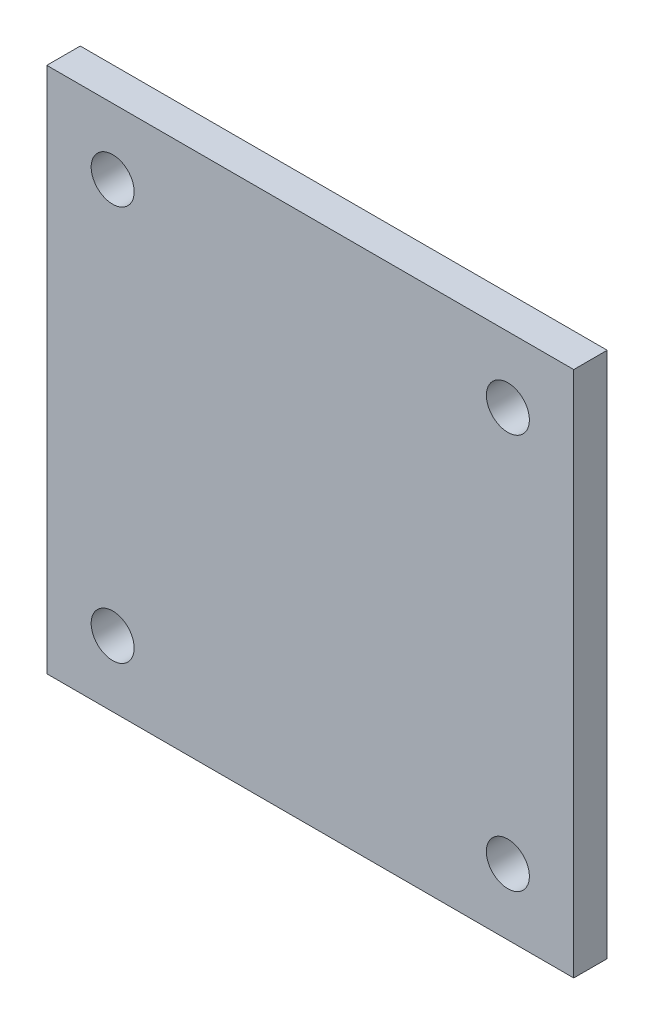
ISO-10303-21;
HEADER;
FILE_DESCRIPTION(('STEP AP214'),'2;1');
FILE_NAME('part.step','',(''),(''),'','','');
FILE_SCHEMA(('AUTOMOTIVE_DESIGN { 1 0 10303 214 1 1 1 1 }'));
ENDSEC;
DATA;
#1=APPLICATION_CONTEXT('core data for automotive mechanical design processes');
#2=APPLICATION_PROTOCOL_DEFINITION('international standard','automotive_design',2000,#1);
#3=PRODUCT_CONTEXT('',#1,'mechanical');
#4=PRODUCT('Part','Part','',(#3));
#5=PRODUCT_RELATED_PRODUCT_CATEGORY('part','',(#4));
#6=PRODUCT_DEFINITION_FORMATION('','',#4);
#7=PRODUCT_DEFINITION_CONTEXT('part definition',#1,'design');
#8=PRODUCT_DEFINITION('design','',#6,#7);
#9=PRODUCT_DEFINITION_SHAPE('','',#8);
#10=(LENGTH_UNIT() NAMED_UNIT(*) SI_UNIT(.MILLI.,.METRE.));
#11=(NAMED_UNIT(*) PLANE_ANGLE_UNIT() SI_UNIT($,.RADIAN.));
#12=(NAMED_UNIT(*) SI_UNIT($,.STERADIAN.) SOLID_ANGLE_UNIT());
#13=UNCERTAINTY_MEASURE_WITH_UNIT(LENGTH_MEASURE(1.E-05),#10,'distance_accuracy_value','');
#14=(GEOMETRIC_REPRESENTATION_CONTEXT(3) GLOBAL_UNCERTAINTY_ASSIGNED_CONTEXT((#13)) GLOBAL_UNIT_ASSIGNED_CONTEXT((#10,
#11,#12)) REPRESENTATION_CONTEXT('',''));
#15=CARTESIAN_POINT('',(0.,0.,0.));
#16=DIRECTION('',(0.,0.,1.));
#17=DIRECTION('',(1.,0.,0.));
#18=AXIS2_PLACEMENT_3D('',#15,#16,#17);
#19=CARTESIAN_POINT('',(20.,20.,2.54));
#20=DIRECTION('',(-1.,0.,0.));
#21=DIRECTION('',(0.,-1.,0.));
#22=AXIS2_PLACEMENT_3D('',#19,#20,#21);
#23=PLANE('',#22);
#24=DIRECTION('',(0.,1.,0.));
#25=VECTOR('',#24,1.);
#26=CARTESIAN_POINT('',(20.,20.,0.));
#27=LINE('',#26,#25);
#28=CARTESIAN_POINT('',(20.,-20.,0.));
#29=VERTEX_POINT('',#28);
#30=CARTESIAN_POINT('',(20.,20.,0.));
#31=VERTEX_POINT('',#30);
#32=EDGE_CURVE('E97',#29,#31,#27,.T.);
#33=ORIENTED_EDGE('',*,*,#32,.T.);
#34=DIRECTION('',(0.,0.,-1.));
#35=VECTOR('',#34,1.);
#36=CARTESIAN_POINT('',(20.,20.,2.54));
#37=LINE('',#36,#35);
#38=CARTESIAN_POINT('',(20.,20.,2.54));
#39=VERTEX_POINT('',#38);
#40=EDGE_CURVE('E11',#39,#31,#37,.T.);
#41=ORIENTED_EDGE('',*,*,#40,.F.);
#42=DIRECTION('',(0.,1.,0.));
#43=VECTOR('',#42,1.);
#44=CARTESIAN_POINT('',(20.,20.,2.54));
#45=LINE('',#44,#43);
#46=CARTESIAN_POINT('',(20.,-20.,2.54));
#47=VERTEX_POINT('',#46);
#48=EDGE_CURVE('E85',#47,#39,#45,.T.);
#49=ORIENTED_EDGE('',*,*,#48,.F.);
#50=DIRECTION('',(0.,0.,-1.));
#51=VECTOR('',#50,1.);
#52=CARTESIAN_POINT('',(20.,-20.,2.54));
#53=LINE('',#52,#51);
#54=EDGE_CURVE('E93',#47,#29,#53,.T.);
#55=ORIENTED_EDGE('',*,*,#54,.T.);
#56=EDGE_LOOP('',(#33,#41,#49,#55));
#57=FACE_BOUND('',#56,.T.);
#58=ADVANCED_FACE('F34',(#57),#23,.F.);
#59=CARTESIAN_POINT('',(-20.,20.,2.54));
#60=DIRECTION('',(0.,-1.,0.));
#61=DIRECTION('',(0.,0.,-1.));
#62=AXIS2_PLACEMENT_3D('',#59,#60,#61);
#63=PLANE('',#62);
#64=DIRECTION('',(-1.,0.,0.));
#65=VECTOR('',#64,1.);
#66=CARTESIAN_POINT('',(-20.,20.,0.));
#67=LINE('',#66,#65);
#68=CARTESIAN_POINT('',(-20.,20.,0.));
#69=VERTEX_POINT('',#68);
#70=EDGE_CURVE('E89',#31,#69,#67,.T.);
#71=ORIENTED_EDGE('',*,*,#70,.T.);
#72=DIRECTION('',(0.,0.,-1.));
#73=VECTOR('',#72,1.);
#74=CARTESIAN_POINT('',(-20.,20.,2.54));
#75=LINE('',#74,#73);
#76=CARTESIAN_POINT('',(-20.,20.,2.54));
#77=VERTEX_POINT('',#76);
#78=EDGE_CURVE('E42',#77,#69,#75,.T.);
#79=ORIENTED_EDGE('',*,*,#78,.F.);
#80=DIRECTION('',(-1.,0.,0.));
#81=VECTOR('',#80,1.);
#82=CARTESIAN_POINT('',(-20.,20.,2.54));
#83=LINE('',#82,#81);
#84=EDGE_CURVE('E80',#39,#77,#83,.T.);
#85=ORIENTED_EDGE('',*,*,#84,.F.);
#86=ORIENTED_EDGE('',*,*,#40,.T.);
#87=EDGE_LOOP('',(#71,#79,#85,#86));
#88=FACE_BOUND('',#87,.T.);
#89=ADVANCED_FACE('F88',(#88),#63,.F.);
#90=CARTESIAN_POINT('',(-20.,20.,2.54));
#91=DIRECTION('',(1.,0.,0.));
#92=DIRECTION('',(0.,1.,0.));
#93=AXIS2_PLACEMENT_3D('',#90,#91,#92);
#94=PLANE('',#93);
#95=DIRECTION('',(0.,-1.,0.));
#96=VECTOR('',#95,1.);
#97=CARTESIAN_POINT('',(-20.,20.,0.));
#98=LINE('',#97,#96);
#99=CARTESIAN_POINT('',(-20.,-20.,0.));
#100=VERTEX_POINT('',#99);
#101=EDGE_CURVE('E67',#69,#100,#98,.T.);
#102=ORIENTED_EDGE('',*,*,#101,.T.);
#103=DIRECTION('',(0.,0.,-1.));
#104=VECTOR('',#103,1.);
#105=CARTESIAN_POINT('',(-20.,-20.,2.54));
#106=LINE('',#105,#104);
#107=CARTESIAN_POINT('',(-20.,-20.,2.54));
#108=VERTEX_POINT('',#107);
#109=EDGE_CURVE('E90',#108,#100,#106,.T.);
#110=ORIENTED_EDGE('',*,*,#109,.F.);
#111=DIRECTION('',(0.,-1.,0.));
#112=VECTOR('',#111,1.);
#113=CARTESIAN_POINT('',(-20.,20.,2.54));
#114=LINE('',#113,#112);
#115=EDGE_CURVE('E83',#77,#108,#114,.T.);
#116=ORIENTED_EDGE('',*,*,#115,.F.);
#117=ORIENTED_EDGE('',*,*,#78,.T.);
#118=EDGE_LOOP('',(#102,#110,#116,#117));
#119=FACE_BOUND('',#118,.T.);
#120=ADVANCED_FACE('F91',(#119),#94,.F.);
#121=CARTESIAN_POINT('',(-20.,-20.,2.54));
#122=DIRECTION('',(0.,1.,0.));
#123=DIRECTION('',(0.,0.,1.));
#124=AXIS2_PLACEMENT_3D('',#121,#122,#123);
#125=PLANE('',#124);
#126=DIRECTION('',(1.,0.,0.));
#127=VECTOR('',#126,1.);
#128=CARTESIAN_POINT('',(-20.,-20.,0.));
#129=LINE('',#128,#127);
#130=EDGE_CURVE('E73',#100,#29,#129,.T.);
#131=ORIENTED_EDGE('',*,*,#130,.T.);
#132=ORIENTED_EDGE('',*,*,#54,.F.);
#133=DIRECTION('',(1.,0.,0.));
#134=VECTOR('',#133,1.);
#135=CARTESIAN_POINT('',(-20.,-20.,2.54));
#136=LINE('',#135,#134);
#137=EDGE_CURVE('E50',#108,#47,#136,.T.);
#138=ORIENTED_EDGE('',*,*,#137,.F.);
#139=ORIENTED_EDGE('',*,*,#109,.T.);
#140=EDGE_LOOP('',(#131,#132,#138,#139));
#141=FACE_BOUND('',#140,.T.);
#142=ADVANCED_FACE('F105',(#141),#125,.F.);
#143=CARTESIAN_POINT('',(0.,0.,2.54));
#144=DIRECTION('',(0.,0.,1.));
#145=DIRECTION('',(1.,0.,0.));
#146=AXIS2_PLACEMENT_3D('',#143,#144,#145);
#147=PLANE('',#146);
#148=CARTESIAN_POINT('',(-15.,15.,2.54));
#149=DIRECTION('',(0.,0.,1.));
#150=DIRECTION('',(1.,0.,0.));
#151=AXIS2_PLACEMENT_3D('',#148,#149,#150);
#152=CIRCLE('',#151,1.63194999999999);
#153=CARTESIAN_POINT('',(-13.36805,15.,2.54));
#154=VERTEX_POINT('',#153);
#155=EDGE_CURVE('E131',#154,#154,#152,.T.);
#156=ORIENTED_EDGE('',*,*,#155,.F.);
#157=EDGE_LOOP('',(#156));
#158=FACE_BOUND('',#157,.T.);
#159=CARTESIAN_POINT('',(15.,15.,2.54));
#160=DIRECTION('',(0.,0.,1.));
#161=DIRECTION('',(1.,0.,0.));
#162=AXIS2_PLACEMENT_3D('',#159,#160,#161);
#163=CIRCLE('',#162,1.63194999999999);
#164=CARTESIAN_POINT('',(16.63195,15.,2.54));
#165=VERTEX_POINT('',#164);
#166=EDGE_CURVE('E125',#165,#165,#163,.T.);
#167=ORIENTED_EDGE('',*,*,#166,.F.);
#168=EDGE_LOOP('',(#167));
#169=FACE_BOUND('',#168,.T.);
#170=CARTESIAN_POINT('',(15.,-15.,2.54));
#171=DIRECTION('',(0.,0.,1.));
#172=DIRECTION('',(1.,0.,0.));
#173=AXIS2_PLACEMENT_3D('',#170,#171,#172);
#174=CIRCLE('',#173,1.63194999999999);
#175=CARTESIAN_POINT('',(16.63195,-15.,2.54));
#176=VERTEX_POINT('',#175);
#177=EDGE_CURVE('E119',#176,#176,#174,.T.);
#178=ORIENTED_EDGE('',*,*,#177,.F.);
#179=EDGE_LOOP('',(#178));
#180=FACE_BOUND('',#179,.T.);
#181=CARTESIAN_POINT('',(-15.,-15.,2.54));
#182=DIRECTION('',(0.,0.,1.));
#183=DIRECTION('',(1.,0.,0.));
#184=AXIS2_PLACEMENT_3D('',#181,#182,#183);
#185=CIRCLE('',#184,1.63194999999999);
#186=CARTESIAN_POINT('',(-13.36805,-15.,2.54));
#187=VERTEX_POINT('',#186);
#188=EDGE_CURVE('E113',#187,#187,#185,.T.);
#189=ORIENTED_EDGE('',*,*,#188,.F.);
#190=EDGE_LOOP('',(#189));
#191=FACE_BOUND('',#190,.T.);
#192=ORIENTED_EDGE('',*,*,#48,.T.);
#193=ORIENTED_EDGE('',*,*,#84,.T.);
#194=ORIENTED_EDGE('',*,*,#115,.T.);
#195=ORIENTED_EDGE('',*,*,#137,.T.);
#196=EDGE_LOOP('',(#192,#193,#194,#195));
#197=FACE_BOUND('',#196,.T.);
#198=ADVANCED_FACE('F81',(#158,#169,#180,#191,#197),#147,.T.);
#199=CARTESIAN_POINT('',(0.,0.,0.));
#200=DIRECTION('',(0.,0.,1.));
#201=DIRECTION('',(1.,0.,0.));
#202=AXIS2_PLACEMENT_3D('',#199,#200,#201);
#203=PLANE('',#202);
#204=CARTESIAN_POINT('',(-15.,15.,0.));
#205=DIRECTION('',(0.,0.,1.));
#206=DIRECTION('',(1.,0.,0.));
#207=AXIS2_PLACEMENT_3D('',#204,#205,#206);
#208=CIRCLE('',#207,1.63195);
#209=CARTESIAN_POINT('',(-13.36805,15.,0.));
#210=VERTEX_POINT('',#209);
#211=EDGE_CURVE('E128',#210,#210,#208,.T.);
#212=ORIENTED_EDGE('',*,*,#211,.T.);
#213=EDGE_LOOP('',(#212));
#214=FACE_BOUND('',#213,.T.);
#215=CARTESIAN_POINT('',(15.,15.,0.));
#216=DIRECTION('',(0.,0.,1.));
#217=DIRECTION('',(1.,0.,0.));
#218=AXIS2_PLACEMENT_3D('',#215,#216,#217);
#219=CIRCLE('',#218,1.63195);
#220=CARTESIAN_POINT('',(16.63195,15.,0.));
#221=VERTEX_POINT('',#220);
#222=EDGE_CURVE('E122',#221,#221,#219,.T.);
#223=ORIENTED_EDGE('',*,*,#222,.T.);
#224=EDGE_LOOP('',(#223));
#225=FACE_BOUND('',#224,.T.);
#226=CARTESIAN_POINT('',(15.,-15.,0.));
#227=DIRECTION('',(0.,0.,1.));
#228=DIRECTION('',(1.,0.,0.));
#229=AXIS2_PLACEMENT_3D('',#226,#227,#228);
#230=CIRCLE('',#229,1.63195);
#231=CARTESIAN_POINT('',(16.63195,-15.,0.));
#232=VERTEX_POINT('',#231);
#233=EDGE_CURVE('E116',#232,#232,#230,.T.);
#234=ORIENTED_EDGE('',*,*,#233,.T.);
#235=EDGE_LOOP('',(#234));
#236=FACE_BOUND('',#235,.T.);
#237=CARTESIAN_POINT('',(-15.,-15.,0.));
#238=DIRECTION('',(0.,0.,1.));
#239=DIRECTION('',(1.,0.,0.));
#240=AXIS2_PLACEMENT_3D('',#237,#238,#239);
#241=CIRCLE('',#240,1.63195);
#242=CARTESIAN_POINT('',(-13.36805,-15.,0.));
#243=VERTEX_POINT('',#242);
#244=EDGE_CURVE('E100',#243,#243,#241,.T.);
#245=ORIENTED_EDGE('',*,*,#244,.T.);
#246=EDGE_LOOP('',(#245));
#247=FACE_BOUND('',#246,.T.);
#248=ORIENTED_EDGE('',*,*,#32,.F.);
#249=ORIENTED_EDGE('',*,*,#130,.F.);
#250=ORIENTED_EDGE('',*,*,#101,.F.);
#251=ORIENTED_EDGE('',*,*,#70,.F.);
#252=EDGE_LOOP('',(#248,#249,#250,#251));
#253=FACE_BOUND('',#252,.T.);
#254=ADVANCED_FACE('F108',(#214,#225,#236,#247,#253),#203,.F.);
#255=CARTESIAN_POINT('',(-15.,-15.,2.54));
#256=DIRECTION('',(0.,0.,1.));
#257=DIRECTION('',(1.,0.,0.));
#258=AXIS2_PLACEMENT_3D('',#255,#256,#257);
#259=CYLINDRICAL_SURFACE('',#258,1.63194999999999);
#260=ORIENTED_EDGE('',*,*,#244,.F.);
#261=EDGE_LOOP('',(#260));
#262=FACE_BOUND('',#261,.T.);
#263=ORIENTED_EDGE('',*,*,#188,.T.);
#264=EDGE_LOOP('',(#263));
#265=FACE_BOUND('',#264,.T.);
#266=ADVANCED_FACE('F146',(#262,#265),#259,.F.);
#267=CARTESIAN_POINT('',(15.,-15.,2.54));
#268=DIRECTION('',(0.,0.,1.));
#269=DIRECTION('',(1.,0.,0.));
#270=AXIS2_PLACEMENT_3D('',#267,#268,#269);
#271=CYLINDRICAL_SURFACE('',#270,1.63194999999999);
#272=ORIENTED_EDGE('',*,*,#233,.F.);
#273=EDGE_LOOP('',(#272));
#274=FACE_BOUND('',#273,.T.);
#275=ORIENTED_EDGE('',*,*,#177,.T.);
#276=EDGE_LOOP('',(#275));
#277=FACE_BOUND('',#276,.T.);
#278=ADVANCED_FACE('F148',(#274,#277),#271,.F.);
#279=CARTESIAN_POINT('',(15.,15.,2.54));
#280=DIRECTION('',(0.,0.,1.));
#281=DIRECTION('',(1.,0.,0.));
#282=AXIS2_PLACEMENT_3D('',#279,#280,#281);
#283=CYLINDRICAL_SURFACE('',#282,1.63194999999999);
#284=ORIENTED_EDGE('',*,*,#222,.F.);
#285=EDGE_LOOP('',(#284));
#286=FACE_BOUND('',#285,.T.);
#287=ORIENTED_EDGE('',*,*,#166,.T.);
#288=EDGE_LOOP('',(#287));
#289=FACE_BOUND('',#288,.T.);
#290=ADVANCED_FACE('F155',(#286,#289),#283,.F.);
#291=CARTESIAN_POINT('',(-15.,15.,2.54));
#292=DIRECTION('',(0.,0.,1.));
#293=DIRECTION('',(1.,0.,0.));
#294=AXIS2_PLACEMENT_3D('',#291,#292,#293);
#295=CYLINDRICAL_SURFACE('',#294,1.63194999999999);
#296=ORIENTED_EDGE('',*,*,#211,.F.);
#297=EDGE_LOOP('',(#296));
#298=FACE_BOUND('',#297,.T.);
#299=ORIENTED_EDGE('',*,*,#155,.T.);
#300=EDGE_LOOP('',(#299));
#301=FACE_BOUND('',#300,.T.);
#302=ADVANCED_FACE('F135',(#298,#301),#295,.F.);
#303=CLOSED_SHELL('',(#58,#89,#120,#142,#198,#254,#266,#278,#290,#302));
#304=MANIFOLD_SOLID_BREP('B2',#303);
#305=ADVANCED_BREP_SHAPE_REPRESENTATION('',(#18,#304),#14);
#306=SHAPE_DEFINITION_REPRESENTATION(#9,#305);
ENDSEC;
END-ISO-10303-21;
